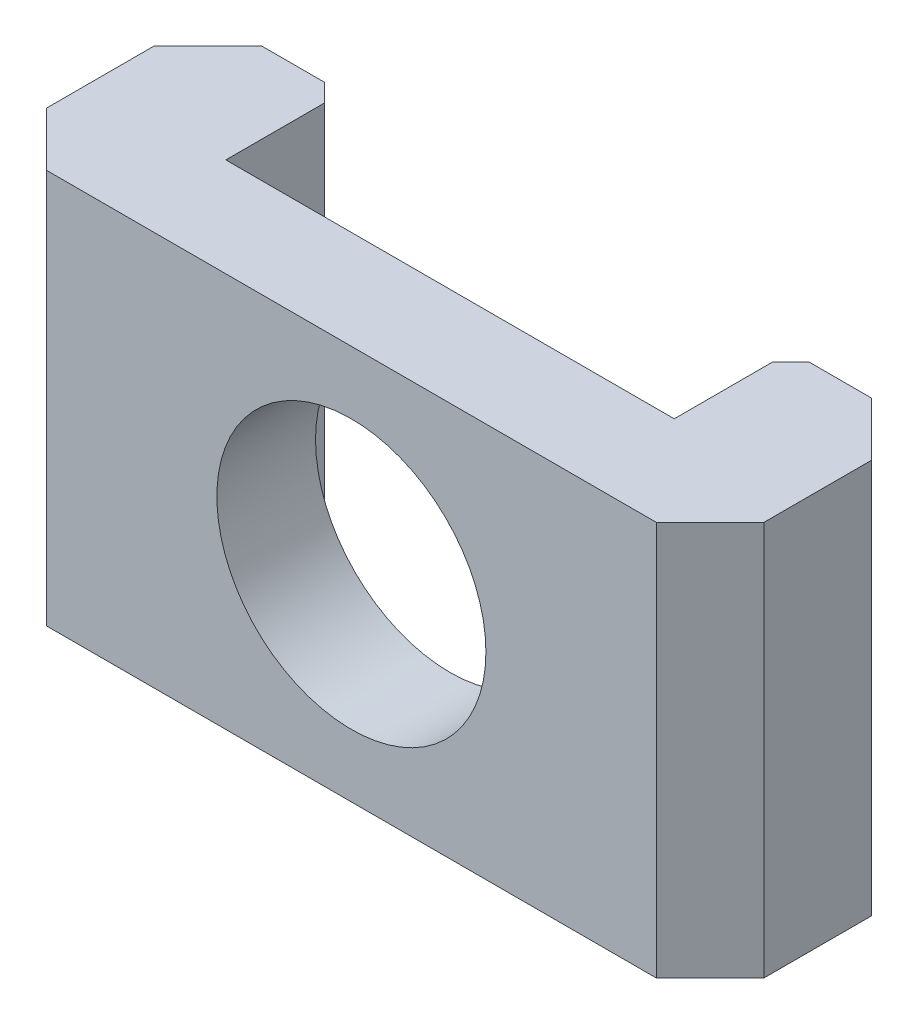
ISO-10303-21;
HEADER;
FILE_DESCRIPTION(('STEP AP214'),'2;1');
FILE_NAME('part.step','',(''),(''),'','','');
FILE_SCHEMA(('AUTOMOTIVE_DESIGN { 1 0 10303 214 1 1 1 1 }'));
ENDSEC;
DATA;
#1=APPLICATION_CONTEXT('core data for automotive mechanical design processes');
#2=APPLICATION_PROTOCOL_DEFINITION('international standard','automotive_design',2000,#1);
#3=PRODUCT_CONTEXT('',#1,'mechanical');
#4=PRODUCT('Part','Part','',(#3));
#5=PRODUCT_RELATED_PRODUCT_CATEGORY('part','',(#4));
#6=PRODUCT_DEFINITION_FORMATION('','',#4);
#7=PRODUCT_DEFINITION_CONTEXT('part definition',#1,'design');
#8=PRODUCT_DEFINITION('design','',#6,#7);
#9=PRODUCT_DEFINITION_SHAPE('','',#8);
#10=(LENGTH_UNIT() NAMED_UNIT(*) SI_UNIT(.MILLI.,.METRE.));
#11=(NAMED_UNIT(*) PLANE_ANGLE_UNIT() SI_UNIT($,.RADIAN.));
#12=(NAMED_UNIT(*) SI_UNIT($,.STERADIAN.) SOLID_ANGLE_UNIT());
#13=UNCERTAINTY_MEASURE_WITH_UNIT(LENGTH_MEASURE(1.E-05),#10,'distance_accuracy_value','');
#14=(GEOMETRIC_REPRESENTATION_CONTEXT(3) GLOBAL_UNCERTAINTY_ASSIGNED_CONTEXT((#13)) GLOBAL_UNIT_ASSIGNED_CONTEXT((#10,
#11,#12)) REPRESENTATION_CONTEXT('',''));
#15=CARTESIAN_POINT('',(0.,0.,0.));
#16=DIRECTION('',(0.,0.,1.));
#17=DIRECTION('',(1.,0.,0.));
#18=AXIS2_PLACEMENT_3D('',#15,#16,#17);
#19=CARTESIAN_POINT('',(-20.,-11.,-6.));
#20=DIRECTION('',(0.,0.,1.));
#21=DIRECTION('',(1.,0.,0.));
#22=AXIS2_PLACEMENT_3D('',#19,#20,#21);
#23=PLANE('',#22);
#24=DIRECTION('',(-1.,0.,0.));
#25=VECTOR('',#24,1.);
#26=CARTESIAN_POINT('',(-20.,11.,-6.));
#27=LINE('',#26,#25);
#28=CARTESIAN_POINT('',(17.,11.,-6.));
#29=VERTEX_POINT('',#28);
#30=CARTESIAN_POINT('',(13.5,11.,-6.));
#31=VERTEX_POINT('',#30);
#32=EDGE_CURVE('E209',#29,#31,#27,.T.);
#33=ORIENTED_EDGE('',*,*,#32,.F.);
#34=DIRECTION('',(0.,-1.,0.));
#35=VECTOR('',#34,1.);
#36=CARTESIAN_POINT('',(17.,-11.,-6.));
#37=LINE('',#36,#35);
#38=CARTESIAN_POINT('',(17.,-11.,-6.));
#39=VERTEX_POINT('',#38);
#40=EDGE_CURVE('E284',#29,#39,#37,.T.);
#41=ORIENTED_EDGE('',*,*,#40,.T.);
#42=DIRECTION('',(1.,0.,0.));
#43=VECTOR('',#42,1.);
#44=CARTESIAN_POINT('',(-20.,-11.,-6.));
#45=LINE('',#44,#43);
#46=CARTESIAN_POINT('',(13.5,-11.,-6.));
#47=VERTEX_POINT('',#46);
#48=EDGE_CURVE('E204',#47,#39,#45,.T.);
#49=ORIENTED_EDGE('',*,*,#48,.F.);
#50=DIRECTION('',(0.,1.,0.));
#51=VECTOR('',#50,1.);
#52=CARTESIAN_POINT('',(13.5,-11.,-6.));
#53=LINE('',#52,#51);
#54=EDGE_CURVE('E268',#47,#31,#53,.T.);
#55=ORIENTED_EDGE('',*,*,#54,.T.);
#56=EDGE_LOOP('',(#33,#41,#49,#55));
#57=FACE_BOUND('',#56,.T.);
#58=ADVANCED_FACE('F38',(#57),#23,.F.);
#59=CARTESIAN_POINT('',(0.,0.,-27.2132034355964));
#60=DIRECTION('',(0.,0.,1.));
#61=DIRECTION('',(1.,0.,0.));
#62=AXIS2_PLACEMENT_3D('',#59,#60,#61);
#63=CYLINDRICAL_SURFACE('',#62,7.5);
#64=CARTESIAN_POINT('',(0.,0.,6.));
#65=DIRECTION('',(0.,0.,1.));
#66=DIRECTION('',(1.,0.,0.));
#67=AXIS2_PLACEMENT_3D('',#64,#65,#66);
#68=CIRCLE('',#67,7.5);
#69=CARTESIAN_POINT('',(7.5,0.,6.));
#70=VERTEX_POINT('',#69);
#71=EDGE_CURVE('E195',#70,#70,#68,.T.);
#72=ORIENTED_EDGE('',*,*,#71,.T.);
#73=EDGE_LOOP('',(#72));
#74=FACE_BOUND('',#73,.T.);
#75=CARTESIAN_POINT('',(0.,0.,0.5));
#76=DIRECTION('',(0.,0.,-1.));
#77=DIRECTION('',(-1.,0.,0.));
#78=AXIS2_PLACEMENT_3D('',#75,#76,#77);
#79=CIRCLE('',#78,7.5);
#80=CARTESIAN_POINT('',(-7.5,0.,0.5));
#81=VERTEX_POINT('',#80);
#82=EDGE_CURVE('E184',#81,#81,#79,.F.);
#83=ORIENTED_EDGE('',*,*,#82,.F.);
#84=EDGE_LOOP('',(#83));
#85=FACE_BOUND('',#84,.T.);
#86=ADVANCED_FACE('F351',(#74,#85),#63,.F.);
#87=CARTESIAN_POINT('',(-20.,11.,6.));
#88=DIRECTION('',(1.,0.,0.));
#89=DIRECTION('',(0.,0.,-1.));
#90=AXIS2_PLACEMENT_3D('',#87,#88,#89);
#91=PLANE('',#90);
#92=DIRECTION('',(0.,0.,-1.));
#93=VECTOR('',#92,1.);
#94=CARTESIAN_POINT('',(-20.,-11.,6.));
#95=LINE('',#94,#93);
#96=CARTESIAN_POINT('',(-20.,-11.,2.99999999999998));
#97=VERTEX_POINT('',#96);
#98=CARTESIAN_POINT('',(-20.,-11.,-3.00000000000001));
#99=VERTEX_POINT('',#98);
#100=EDGE_CURVE('E225',#97,#99,#95,.T.);
#101=ORIENTED_EDGE('',*,*,#100,.F.);
#102=DIRECTION('',(0.,1.,0.));
#103=VECTOR('',#102,1.);
#104=CARTESIAN_POINT('',(-20.,11.,2.99999999999998));
#105=LINE('',#104,#103);
#106=CARTESIAN_POINT('',(-20.,11.,2.99999999999998));
#107=VERTEX_POINT('',#106);
#108=EDGE_CURVE('E46',#97,#107,#105,.T.);
#109=ORIENTED_EDGE('',*,*,#108,.T.);
#110=DIRECTION('',(0.,0.,-1.));
#111=VECTOR('',#110,1.);
#112=CARTESIAN_POINT('',(-20.,11.,6.));
#113=LINE('',#112,#111);
#114=CARTESIAN_POINT('',(-20.,11.,-3.00000000000001));
#115=VERTEX_POINT('',#114);
#116=EDGE_CURVE('E212',#107,#115,#113,.T.);
#117=ORIENTED_EDGE('',*,*,#116,.T.);
#118=DIRECTION('',(0.,-1.,0.));
#119=VECTOR('',#118,1.);
#120=CARTESIAN_POINT('',(-20.,11.,-3.));
#121=LINE('',#120,#119);
#122=EDGE_CURVE('E298',#115,#99,#121,.T.);
#123=ORIENTED_EDGE('',*,*,#122,.T.);
#124=EDGE_LOOP('',(#101,#109,#117,#123));
#125=FACE_BOUND('',#124,.T.);
#126=ADVANCED_FACE('F302',(#125),#91,.F.);
#127=CARTESIAN_POINT('',(-20.,-11.,6.));
#128=DIRECTION('',(0.,1.,0.));
#129=DIRECTION('',(0.,0.,1.));
#130=AXIS2_PLACEMENT_3D('',#127,#128,#129);
#131=PLANE('',#130);
#132=CARTESIAN_POINT('',(16.5,-11.,-3.5));
#133=DIRECTION('',(0.,1.,0.));
#134=DIRECTION('',(0.,0.,1.));
#135=AXIS2_PLACEMENT_3D('',#132,#133,#134);
#136=CIRCLE('',#135,1.75000000000001);
#137=CARTESIAN_POINT('',(16.5,-11.,-1.74999999999999));
#138=VERTEX_POINT('',#137);
#139=EDGE_CURVE('E245',#138,#138,#136,.T.);
#140=ORIENTED_EDGE('',*,*,#139,.T.);
#141=EDGE_LOOP('',(#140));
#142=FACE_BOUND('',#141,.T.);
#143=CARTESIAN_POINT('',(-16.5,-11.,-3.5));
#144=DIRECTION('',(0.,1.,0.));
#145=DIRECTION('',(0.,0.,1.));
#146=AXIS2_PLACEMENT_3D('',#143,#144,#145);
#147=CIRCLE('',#146,1.75000000000001);
#148=CARTESIAN_POINT('',(-16.5,-11.,-1.74999999999999));
#149=VERTEX_POINT('',#148);
#150=EDGE_CURVE('E242',#149,#149,#147,.T.);
#151=ORIENTED_EDGE('',*,*,#150,.T.);
#152=EDGE_LOOP('',(#151));
#153=FACE_BOUND('',#152,.T.);
#154=CARTESIAN_POINT('',(16.5,-11.,3.5));
#155=DIRECTION('',(0.,1.,0.));
#156=DIRECTION('',(0.,0.,1.));
#157=AXIS2_PLACEMENT_3D('',#154,#155,#156);
#158=CIRCLE('',#157,1.74999999999999);
#159=CARTESIAN_POINT('',(16.5,-11.,5.24999999999999));
#160=VERTEX_POINT('',#159);
#161=EDGE_CURVE('E233',#160,#160,#158,.T.);
#162=ORIENTED_EDGE('',*,*,#161,.T.);
#163=EDGE_LOOP('',(#162));
#164=FACE_BOUND('',#163,.T.);
#165=CARTESIAN_POINT('',(-16.5,-11.,3.5));
#166=DIRECTION('',(0.,1.,0.));
#167=DIRECTION('',(0.,0.,1.));
#168=AXIS2_PLACEMENT_3D('',#165,#166,#167);
#169=CIRCLE('',#168,1.74999999999999);
#170=CARTESIAN_POINT('',(-16.5,-11.,5.24999999999999));
#171=VERTEX_POINT('',#170);
#172=EDGE_CURVE('E230',#171,#171,#169,.T.);
#173=ORIENTED_EDGE('',*,*,#172,.T.);
#174=EDGE_LOOP('',(#173));
#175=FACE_BOUND('',#174,.T.);
#176=ORIENTED_EDGE('',*,*,#48,.T.);
#177=DIRECTION('',(-0.707106781186549,0.,-0.707106781186546));
#178=VECTOR('',#177,1.);
#179=CARTESIAN_POINT('',(20.,-11.,-3.));
#180=LINE('',#179,#178);
#181=CARTESIAN_POINT('',(20.,-11.,-3.00000000000001));
#182=VERTEX_POINT('',#181);
#183=EDGE_CURVE('E290',#39,#182,#180,.F.);
#184=ORIENTED_EDGE('',*,*,#183,.T.);
#185=DIRECTION('',(0.,0.,-1.));
#186=VECTOR('',#185,1.);
#187=CARTESIAN_POINT('',(20.,-11.,6.));
#188=LINE('',#187,#186);
#189=CARTESIAN_POINT('',(20.,-11.,2.99999999999998));
#190=VERTEX_POINT('',#189);
#191=EDGE_CURVE('E222',#190,#182,#188,.T.);
#192=ORIENTED_EDGE('',*,*,#191,.F.);
#193=DIRECTION('',(-0.707106781186547,0.,0.707106781186548));
#194=VECTOR('',#193,1.);
#195=CARTESIAN_POINT('',(17.,-11.,6.));
#196=LINE('',#195,#194);
#197=CARTESIAN_POINT('',(17.,-11.,6.));
#198=VERTEX_POINT('',#197);
#199=EDGE_CURVE('E288',#190,#198,#196,.T.);
#200=ORIENTED_EDGE('',*,*,#199,.T.);
#201=DIRECTION('',(1.,0.,0.));
#202=VECTOR('',#201,1.);
#203=CARTESIAN_POINT('',(-20.,-11.,6.));
#204=LINE('',#203,#202);
#205=CARTESIAN_POINT('',(-17.,-11.,6.));
#206=VERTEX_POINT('',#205);
#207=EDGE_CURVE('E205',#206,#198,#204,.T.);
#208=ORIENTED_EDGE('',*,*,#207,.F.);
#209=DIRECTION('',(-0.707106781186547,0.,-0.707106781186548));
#210=VECTOR('',#209,1.);
#211=CARTESIAN_POINT('',(-17.,-11.,6.));
#212=LINE('',#211,#210);
#213=EDGE_CURVE('E61',#206,#97,#212,.T.);
#214=ORIENTED_EDGE('',*,*,#213,.T.);
#215=ORIENTED_EDGE('',*,*,#100,.T.);
#216=DIRECTION('',(-0.707106781186549,0.,0.707106781186546));
#217=VECTOR('',#216,1.);
#218=CARTESIAN_POINT('',(-20.,-11.,-3.));
#219=LINE('',#218,#217);
#220=CARTESIAN_POINT('',(-17.,-11.,-6.));
#221=VERTEX_POINT('',#220);
#222=EDGE_CURVE('E53',#99,#221,#219,.F.);
#223=ORIENTED_EDGE('',*,*,#222,.T.);
#224=CARTESIAN_POINT('',(-13.5,-11.,-6.));
#225=VERTEX_POINT('',#224);
#226=EDGE_CURVE('E213',#221,#225,#45,.T.);
#227=ORIENTED_EDGE('',*,*,#226,.T.);
#228=DIRECTION('',(-0.707106781186548,0.,-0.707106781186548));
#229=VECTOR('',#228,1.);
#230=CARTESIAN_POINT('',(-12.5,-11.,-5.00000000000001));
#231=LINE('',#230,#229);
#232=CARTESIAN_POINT('',(-12.5,-11.,-5.));
#233=VERTEX_POINT('',#232);
#234=EDGE_CURVE('E265',#225,#233,#231,.F.);
#235=ORIENTED_EDGE('',*,*,#234,.T.);
#236=DIRECTION('',(0.,0.,-1.));
#237=VECTOR('',#236,1.);
#238=CARTESIAN_POINT('',(-12.5,-11.,0.5));
#239=LINE('',#238,#237);
#240=CARTESIAN_POINT('',(-12.5,-11.,0.5));
#241=VERTEX_POINT('',#240);
#242=EDGE_CURVE('E161',#241,#233,#239,.T.);
#243=ORIENTED_EDGE('',*,*,#242,.F.);
#244=DIRECTION('',(-1.,0.,0.));
#245=VECTOR('',#244,1.);
#246=CARTESIAN_POINT('',(12.5,-11.,0.5));
#247=LINE('',#246,#245);
#248=CARTESIAN_POINT('',(12.5,-11.,0.5));
#249=VERTEX_POINT('',#248);
#250=EDGE_CURVE('E169',#249,#241,#247,.T.);
#251=ORIENTED_EDGE('',*,*,#250,.F.);
#252=DIRECTION('',(0.,0.,-1.));
#253=VECTOR('',#252,1.);
#254=CARTESIAN_POINT('',(12.5,-11.,0.5));
#255=LINE('',#254,#253);
#256=CARTESIAN_POINT('',(12.5,-11.,-5.));
#257=VERTEX_POINT('',#256);
#258=EDGE_CURVE('E152',#249,#257,#255,.T.);
#259=ORIENTED_EDGE('',*,*,#258,.T.);
#260=DIRECTION('',(-0.707106781186549,0.,0.707106781186546));
#261=VECTOR('',#260,1.);
#262=CARTESIAN_POINT('',(12.5,-11.,-5.00000000000001));
#263=LINE('',#262,#261);
#264=EDGE_CURVE('E263',#257,#47,#263,.F.);
#265=ORIENTED_EDGE('',*,*,#264,.T.);
#266=EDGE_LOOP('',(#176,#184,#192,#200,#208,#214,#215,#223,#227,#235,#243,#251,#259,#265));
#267=FACE_BOUND('',#266,.T.);
#268=ADVANCED_FACE('F175',(#142,#153,#164,#175,#267),#131,.F.);
#269=CARTESIAN_POINT('',(20.,11.,6.));
#270=DIRECTION('',(-1.,0.,0.));
#271=DIRECTION('',(0.,0.,1.));
#272=AXIS2_PLACEMENT_3D('',#269,#270,#271);
#273=PLANE('',#272);
#274=ORIENTED_EDGE('',*,*,#191,.T.);
#275=DIRECTION('',(0.,1.,0.));
#276=VECTOR('',#275,1.);
#277=CARTESIAN_POINT('',(20.,11.,-3.));
#278=LINE('',#277,#276);
#279=CARTESIAN_POINT('',(20.,11.,-3.00000000000001));
#280=VERTEX_POINT('',#279);
#281=EDGE_CURVE('E273',#182,#280,#278,.T.);
#282=ORIENTED_EDGE('',*,*,#281,.T.);
#283=DIRECTION('',(0.,0.,-1.));
#284=VECTOR('',#283,1.);
#285=CARTESIAN_POINT('',(20.,11.,6.));
#286=LINE('',#285,#284);
#287=CARTESIAN_POINT('',(20.,11.,2.99999999999998));
#288=VERTEX_POINT('',#287);
#289=EDGE_CURVE('E219',#288,#280,#286,.T.);
#290=ORIENTED_EDGE('',*,*,#289,.F.);
#291=DIRECTION('',(0.,-1.,0.));
#292=VECTOR('',#291,1.);
#293=CARTESIAN_POINT('',(20.,-11.,2.99999999999998));
#294=LINE('',#293,#292);
#295=EDGE_CURVE('E271',#288,#190,#294,.T.);
#296=ORIENTED_EDGE('',*,*,#295,.T.);
#297=EDGE_LOOP('',(#274,#282,#290,#296));
#298=FACE_BOUND('',#297,.T.);
#299=ADVANCED_FACE('F322',(#298),#273,.F.);
#300=CARTESIAN_POINT('',(-20.,11.,6.));
#301=DIRECTION('',(0.,-1.,0.));
#302=DIRECTION('',(0.,0.,-1.));
#303=AXIS2_PLACEMENT_3D('',#300,#301,#302);
#304=PLANE('',#303);
#305=ORIENTED_EDGE('',*,*,#289,.T.);
#306=DIRECTION('',(0.707106781186549,0.,0.707106781186546));
#307=VECTOR('',#306,1.);
#308=CARTESIAN_POINT('',(20.,11.,-3.));
#309=LINE('',#308,#307);
#310=EDGE_CURVE('E282',#280,#29,#309,.F.);
#311=ORIENTED_EDGE('',*,*,#310,.T.);
#312=ORIENTED_EDGE('',*,*,#32,.T.);
#313=DIRECTION('',(0.707106781186549,0.,-0.707106781186546));
#314=VECTOR('',#313,1.);
#315=CARTESIAN_POINT('',(12.5,11.,-5.00000000000001));
#316=LINE('',#315,#314);
#317=CARTESIAN_POINT('',(12.5,11.,-5.));
#318=VERTEX_POINT('',#317);
#319=EDGE_CURVE('E256',#31,#318,#316,.F.);
#320=ORIENTED_EDGE('',*,*,#319,.T.);
#321=DIRECTION('',(0.,0.,-1.));
#322=VECTOR('',#321,1.);
#323=CARTESIAN_POINT('',(12.5,11.,0.5));
#324=LINE('',#323,#322);
#325=CARTESIAN_POINT('',(12.5,11.,0.5));
#326=VERTEX_POINT('',#325);
#327=EDGE_CURVE('E182',#326,#318,#324,.T.);
#328=ORIENTED_EDGE('',*,*,#327,.F.);
#329=DIRECTION('',(1.,0.,0.));
#330=VECTOR('',#329,1.);
#331=CARTESIAN_POINT('',(12.5,11.,0.5));
#332=LINE('',#331,#330);
#333=CARTESIAN_POINT('',(-12.5,11.,0.5));
#334=VERTEX_POINT('',#333);
#335=EDGE_CURVE('E162',#334,#326,#332,.T.);
#336=ORIENTED_EDGE('',*,*,#335,.F.);
#337=DIRECTION('',(0.,0.,-1.));
#338=VECTOR('',#337,1.);
#339=CARTESIAN_POINT('',(-12.5,11.,0.5));
#340=LINE('',#339,#338);
#341=CARTESIAN_POINT('',(-12.5,11.,-5.));
#342=VERTEX_POINT('',#341);
#343=EDGE_CURVE('E185',#334,#342,#340,.T.);
#344=ORIENTED_EDGE('',*,*,#343,.T.);
#345=DIRECTION('',(0.707106781186548,0.,0.707106781186548));
#346=VECTOR('',#345,1.);
#347=CARTESIAN_POINT('',(-12.5,11.,-5.00000000000001));
#348=LINE('',#347,#346);
#349=CARTESIAN_POINT('',(-13.5,11.,-6.));
#350=VERTEX_POINT('',#349);
#351=EDGE_CURVE('E258',#342,#350,#348,.F.);
#352=ORIENTED_EDGE('',*,*,#351,.T.);
#353=CARTESIAN_POINT('',(-17.,11.,-6.));
#354=VERTEX_POINT('',#353);
#355=EDGE_CURVE('E215',#350,#354,#27,.T.);
#356=ORIENTED_EDGE('',*,*,#355,.T.);
#357=DIRECTION('',(0.707106781186549,0.,-0.707106781186546));
#358=VECTOR('',#357,1.);
#359=CARTESIAN_POINT('',(-20.,11.,-3.));
#360=LINE('',#359,#358);
#361=EDGE_CURVE('E276',#354,#115,#360,.F.);
#362=ORIENTED_EDGE('',*,*,#361,.T.);
#363=ORIENTED_EDGE('',*,*,#116,.F.);
#364=DIRECTION('',(0.707106781186547,0.,0.707106781186548));
#365=VECTOR('',#364,1.);
#366=CARTESIAN_POINT('',(-17.,11.,6.));
#367=LINE('',#366,#365);
#368=CARTESIAN_POINT('',(-17.,11.,6.));
#369=VERTEX_POINT('',#368);
#370=EDGE_CURVE('E278',#107,#369,#367,.T.);
#371=ORIENTED_EDGE('',*,*,#370,.T.);
#372=DIRECTION('',(-1.,0.,0.));
#373=VECTOR('',#372,1.);
#374=CARTESIAN_POINT('',(-20.,11.,6.));
#375=LINE('',#374,#373);
#376=CARTESIAN_POINT('',(17.,11.,6.));
#377=VERTEX_POINT('',#376);
#378=EDGE_CURVE('E208',#377,#369,#375,.T.);
#379=ORIENTED_EDGE('',*,*,#378,.F.);
#380=DIRECTION('',(0.707106781186547,0.,-0.707106781186548));
#381=VECTOR('',#380,1.);
#382=CARTESIAN_POINT('',(17.,11.,6.));
#383=LINE('',#382,#381);
#384=EDGE_CURVE('E280',#377,#288,#383,.T.);
#385=ORIENTED_EDGE('',*,*,#384,.T.);
#386=EDGE_LOOP('',(#305,#311,#312,#320,#328,#336,#344,#352,#356,#362,#363,#371,#379,#385));
#387=FACE_BOUND('',#386,.T.);
#388=ADVANCED_FACE('F306',(#387),#304,.F.);
#389=CARTESIAN_POINT('',(-20.,-11.,6.));
#390=DIRECTION('',(0.,0.,1.));
#391=DIRECTION('',(1.,0.,0.));
#392=AXIS2_PLACEMENT_3D('',#389,#390,#391);
#393=PLANE('',#392);
#394=ORIENTED_EDGE('',*,*,#71,.F.);
#395=EDGE_LOOP('',(#394));
#396=FACE_BOUND('',#395,.T.);
#397=ORIENTED_EDGE('',*,*,#207,.T.);
#398=DIRECTION('',(0.,1.,0.));
#399=VECTOR('',#398,1.);
#400=CARTESIAN_POINT('',(17.,11.,6.));
#401=LINE('',#400,#399);
#402=EDGE_CURVE('E295',#198,#377,#401,.T.);
#403=ORIENTED_EDGE('',*,*,#402,.T.);
#404=ORIENTED_EDGE('',*,*,#378,.T.);
#405=DIRECTION('',(0.,-1.,0.));
#406=VECTOR('',#405,1.);
#407=CARTESIAN_POINT('',(-17.,-11.,6.));
#408=LINE('',#407,#406);
#409=EDGE_CURVE('E292',#369,#206,#408,.T.);
#410=ORIENTED_EDGE('',*,*,#409,.T.);
#411=EDGE_LOOP('',(#397,#403,#404,#410));
#412=FACE_BOUND('',#411,.T.);
#413=ADVANCED_FACE('F313',(#396,#412),#393,.T.);
#414=ORIENTED_EDGE('',*,*,#226,.F.);
#415=DIRECTION('',(0.,1.,0.));
#416=VECTOR('',#415,1.);
#417=CARTESIAN_POINT('',(-17.,-11.,-6.));
#418=LINE('',#417,#416);
#419=EDGE_CURVE('E11',#221,#354,#418,.T.);
#420=ORIENTED_EDGE('',*,*,#419,.T.);
#421=ORIENTED_EDGE('',*,*,#355,.F.);
#422=DIRECTION('',(0.,-1.,0.));
#423=VECTOR('',#422,1.);
#424=CARTESIAN_POINT('',(-13.5,-11.,-6.));
#425=LINE('',#424,#423);
#426=EDGE_CURVE('E260',#350,#225,#425,.T.);
#427=ORIENTED_EDGE('',*,*,#426,.T.);
#428=EDGE_LOOP('',(#414,#420,#421,#427));
#429=FACE_BOUND('',#428,.T.);
#430=ADVANCED_FACE('F345',(#429),#23,.F.);
#431=CARTESIAN_POINT('',(16.5,-1.5,3.5));
#432=DIRECTION('',(0.,-1.,0.));
#433=DIRECTION('',(0.,0.,-1.));
#434=AXIS2_PLACEMENT_3D('',#431,#432,#433);
#435=CONICAL_SURFACE('',#434,1.25,1.02974425867665);
#436=CARTESIAN_POINT('',(16.5,-0.748924226215548,3.5));
#437=VERTEX_POINT('',#436);
#438=VERTEX_LOOP('',#437);
#439=FACE_BOUND('',#438,.T.);
#440=CARTESIAN_POINT('',(16.5,-1.5,3.5));
#441=DIRECTION('',(0.,-1.,0.));
#442=DIRECTION('',(0.,0.,-1.));
#443=AXIS2_PLACEMENT_3D('',#440,#441,#442);
#444=CIRCLE('',#443,1.25);
#445=CARTESIAN_POINT('',(16.5,-1.5,2.25));
#446=VERTEX_POINT('',#445);
#447=EDGE_CURVE('E201',#446,#446,#444,.T.);
#448=ORIENTED_EDGE('',*,*,#447,.T.);
#449=EDGE_LOOP('',(#448));
#450=FACE_BOUND('',#449,.T.);
#451=ADVANCED_FACE('F361',(#439,#450),#435,.F.);
#452=CARTESIAN_POINT('',(16.5,-11.,3.5));
#453=DIRECTION('',(0.,-1.,0.));
#454=DIRECTION('',(0.,0.,-1.));
#455=AXIS2_PLACEMENT_3D('',#452,#453,#454);
#456=CYLINDRICAL_SURFACE('',#455,1.25);
#457=CARTESIAN_POINT('',(16.5,-10.5,3.5));
#458=DIRECTION('',(0.,1.,0.));
#459=DIRECTION('',(0.,0.,1.));
#460=AXIS2_PLACEMENT_3D('',#457,#458,#459);
#461=CIRCLE('',#460,1.25);
#462=CARTESIAN_POINT('',(16.5,-10.5,4.75));
#463=VERTEX_POINT('',#462);
#464=EDGE_CURVE('E227',#463,#463,#461,.F.);
#465=ORIENTED_EDGE('',*,*,#464,.T.);
#466=EDGE_LOOP('',(#465));
#467=FACE_BOUND('',#466,.T.);
#468=ORIENTED_EDGE('',*,*,#447,.F.);
#469=EDGE_LOOP('',(#468));
#470=FACE_BOUND('',#469,.T.);
#471=ADVANCED_FACE('F366',(#467,#470),#456,.F.);
#472=CARTESIAN_POINT('',(-16.5,-1.5,3.5));
#473=DIRECTION('',(0.,-1.,0.));
#474=DIRECTION('',(0.,0.,-1.));
#475=AXIS2_PLACEMENT_3D('',#472,#473,#474);
#476=CONICAL_SURFACE('',#475,1.25,1.02974425867665);
#477=CARTESIAN_POINT('',(-16.5,-0.748924226215548,3.5));
#478=VERTEX_POINT('',#477);
#479=VERTEX_LOOP('',#478);
#480=FACE_BOUND('',#479,.T.);
#481=CARTESIAN_POINT('',(-16.5,-1.5,3.5));
#482=DIRECTION('',(0.,-1.,0.));
#483=DIRECTION('',(0.,0.,-1.));
#484=AXIS2_PLACEMENT_3D('',#481,#482,#483);
#485=CIRCLE('',#484,1.25);
#486=CARTESIAN_POINT('',(-16.5,-1.5,2.25));
#487=VERTEX_POINT('',#486);
#488=EDGE_CURVE('E198',#487,#487,#485,.T.);
#489=ORIENTED_EDGE('',*,*,#488,.T.);
#490=EDGE_LOOP('',(#489));
#491=FACE_BOUND('',#490,.T.);
#492=ADVANCED_FACE('F377',(#480,#491),#476,.F.);
#493=CARTESIAN_POINT('',(-16.5,-11.,3.5));
#494=DIRECTION('',(0.,-1.,0.));
#495=DIRECTION('',(0.,0.,-1.));
#496=AXIS2_PLACEMENT_3D('',#493,#494,#495);
#497=CYLINDRICAL_SURFACE('',#496,1.25);
#498=CARTESIAN_POINT('',(-16.5,-10.5,3.5));
#499=DIRECTION('',(0.,1.,0.));
#500=DIRECTION('',(0.,0.,1.));
#501=AXIS2_PLACEMENT_3D('',#498,#499,#500);
#502=CIRCLE('',#501,1.25);
#503=CARTESIAN_POINT('',(-16.5,-10.5,4.75));
#504=VERTEX_POINT('',#503);
#505=EDGE_CURVE('E236',#504,#504,#502,.F.);
#506=ORIENTED_EDGE('',*,*,#505,.T.);
#507=EDGE_LOOP('',(#506));
#508=FACE_BOUND('',#507,.T.);
#509=ORIENTED_EDGE('',*,*,#488,.F.);
#510=EDGE_LOOP('',(#509));
#511=FACE_BOUND('',#510,.T.);
#512=ADVANCED_FACE('F381',(#508,#511),#497,.F.);
#513=CARTESIAN_POINT('',(16.5,-10.5,3.5));
#514=DIRECTION('',(0.,-1.,0.));
#515=DIRECTION('',(0.,0.,-1.));
#516=AXIS2_PLACEMENT_3D('',#513,#514,#515);
#517=CONICAL_SURFACE('',#516,1.25,0.785398163397451);
#518=ORIENTED_EDGE('',*,*,#161,.F.);
#519=EDGE_LOOP('',(#518));
#520=FACE_BOUND('',#519,.T.);
#521=ORIENTED_EDGE('',*,*,#464,.F.);
#522=EDGE_LOOP('',(#521));
#523=FACE_BOUND('',#522,.T.);
#524=ADVANCED_FACE('F384',(#520,#523),#517,.F.);
#525=CARTESIAN_POINT('',(-16.5,-10.5,3.5));
#526=DIRECTION('',(0.,-1.,0.));
#527=DIRECTION('',(0.,0.,-1.));
#528=AXIS2_PLACEMENT_3D('',#525,#526,#527);
#529=CONICAL_SURFACE('',#528,1.25,0.78539816339745);
#530=ORIENTED_EDGE('',*,*,#172,.F.);
#531=EDGE_LOOP('',(#530));
#532=FACE_BOUND('',#531,.T.);
#533=ORIENTED_EDGE('',*,*,#505,.F.);
#534=EDGE_LOOP('',(#533));
#535=FACE_BOUND('',#534,.T.);
#536=ADVANCED_FACE('F391',(#532,#535),#529,.F.);
#537=CARTESIAN_POINT('',(16.5,-1.5,-3.5));
#538=DIRECTION('',(0.,-1.,0.));
#539=DIRECTION('',(0.,0.,-1.));
#540=AXIS2_PLACEMENT_3D('',#537,#538,#539);
#541=CONICAL_SURFACE('',#540,1.25,1.02974425867665);
#542=CARTESIAN_POINT('',(16.5,-0.748924226215548,-3.5));
#543=VERTEX_POINT('',#542);
#544=VERTEX_LOOP('',#543);
#545=FACE_BOUND('',#544,.T.);
#546=CARTESIAN_POINT('',(16.5,-1.5,-3.5));
#547=DIRECTION('',(0.,-1.,0.));
#548=DIRECTION('',(0.,0.,-1.));
#549=AXIS2_PLACEMENT_3D('',#546,#547,#548);
#550=CIRCLE('',#549,1.25);
#551=CARTESIAN_POINT('',(16.5,-1.5,-4.75));
#552=VERTEX_POINT('',#551);
#553=EDGE_CURVE('E192',#552,#552,#550,.T.);
#554=ORIENTED_EDGE('',*,*,#553,.T.);
#555=EDGE_LOOP('',(#554));
#556=FACE_BOUND('',#555,.T.);
#557=ADVANCED_FACE('F387',(#545,#556),#541,.F.);
#558=CARTESIAN_POINT('',(16.5,-11.,-3.5));
#559=DIRECTION('',(0.,-1.,0.));
#560=DIRECTION('',(0.,0.,-1.));
#561=AXIS2_PLACEMENT_3D('',#558,#559,#560);
#562=CYLINDRICAL_SURFACE('',#561,1.25);
#563=CARTESIAN_POINT('',(16.5,-10.5,-3.5));
#564=DIRECTION('',(0.,1.,0.));
#565=DIRECTION('',(0.,0.,1.));
#566=AXIS2_PLACEMENT_3D('',#563,#564,#565);
#567=CIRCLE('',#566,1.25);
#568=CARTESIAN_POINT('',(16.5,-10.5,-2.25));
#569=VERTEX_POINT('',#568);
#570=EDGE_CURVE('E239',#569,#569,#567,.F.);
#571=ORIENTED_EDGE('',*,*,#570,.T.);
#572=EDGE_LOOP('',(#571));
#573=FACE_BOUND('',#572,.T.);
#574=ORIENTED_EDGE('',*,*,#553,.F.);
#575=EDGE_LOOP('',(#574));
#576=FACE_BOUND('',#575,.T.);
#577=ADVANCED_FACE('F390',(#573,#576),#562,.F.);
#578=CARTESIAN_POINT('',(-16.5,-1.5,-3.5));
#579=DIRECTION('',(0.,-1.,0.));
#580=DIRECTION('',(0.,0.,-1.));
#581=AXIS2_PLACEMENT_3D('',#578,#579,#580);
#582=CONICAL_SURFACE('',#581,1.25,1.02974425867665);
#583=CARTESIAN_POINT('',(-16.5,-0.748924226215548,-3.5));
#584=VERTEX_POINT('',#583);
#585=VERTEX_LOOP('',#584);
#586=FACE_BOUND('',#585,.T.);
#587=CARTESIAN_POINT('',(-16.5,-1.5,-3.5));
#588=DIRECTION('',(0.,-1.,0.));
#589=DIRECTION('',(0.,0.,-1.));
#590=AXIS2_PLACEMENT_3D('',#587,#588,#589);
#591=CIRCLE('',#590,1.25);
#592=CARTESIAN_POINT('',(-16.5,-1.5,-4.75));
#593=VERTEX_POINT('',#592);
#594=EDGE_CURVE('E189',#593,#593,#591,.T.);
#595=ORIENTED_EDGE('',*,*,#594,.T.);
#596=EDGE_LOOP('',(#595));
#597=FACE_BOUND('',#596,.T.);
#598=ADVANCED_FACE('F395',(#586,#597),#582,.F.);
#599=CARTESIAN_POINT('',(-16.5,-11.,-3.5));
#600=DIRECTION('',(0.,-1.,0.));
#601=DIRECTION('',(0.,0.,-1.));
#602=AXIS2_PLACEMENT_3D('',#599,#600,#601);
#603=CYLINDRICAL_SURFACE('',#602,1.25);
#604=CARTESIAN_POINT('',(-16.5,-10.5,-3.5));
#605=DIRECTION('',(0.,1.,0.));
#606=DIRECTION('',(0.,0.,1.));
#607=AXIS2_PLACEMENT_3D('',#604,#605,#606);
#608=CIRCLE('',#607,1.25);
#609=CARTESIAN_POINT('',(-16.5,-10.5,-2.25));
#610=VERTEX_POINT('',#609);
#611=EDGE_CURVE('E248',#610,#610,#608,.F.);
#612=ORIENTED_EDGE('',*,*,#611,.T.);
#613=EDGE_LOOP('',(#612));
#614=FACE_BOUND('',#613,.T.);
#615=ORIENTED_EDGE('',*,*,#594,.F.);
#616=EDGE_LOOP('',(#615));
#617=FACE_BOUND('',#616,.T.);
#618=ADVANCED_FACE('F399',(#614,#617),#603,.F.);
#619=CARTESIAN_POINT('',(16.5,-10.5,-3.5));
#620=DIRECTION('',(0.,-1.,0.));
#621=DIRECTION('',(0.,0.,-1.));
#622=AXIS2_PLACEMENT_3D('',#619,#620,#621);
#623=CONICAL_SURFACE('',#622,1.25,0.785398163397452);
#624=ORIENTED_EDGE('',*,*,#139,.F.);
#625=EDGE_LOOP('',(#624));
#626=FACE_BOUND('',#625,.T.);
#627=ORIENTED_EDGE('',*,*,#570,.F.);
#628=EDGE_LOOP('',(#627));
#629=FACE_BOUND('',#628,.T.);
#630=ADVANCED_FACE('F403',(#626,#629),#623,.F.);
#631=CARTESIAN_POINT('',(-16.5,-10.5,-3.5));
#632=DIRECTION('',(0.,-1.,0.));
#633=DIRECTION('',(0.,0.,-1.));
#634=AXIS2_PLACEMENT_3D('',#631,#632,#633);
#635=CONICAL_SURFACE('',#634,1.25,0.785398163397451);
#636=ORIENTED_EDGE('',*,*,#150,.F.);
#637=EDGE_LOOP('',(#636));
#638=FACE_BOUND('',#637,.T.);
#639=ORIENTED_EDGE('',*,*,#611,.F.);
#640=EDGE_LOOP('',(#639));
#641=FACE_BOUND('',#640,.T.);
#642=ADVANCED_FACE('F410',(#638,#641),#635,.F.);
#643=CARTESIAN_POINT('',(12.5,-11.,0.5));
#644=DIRECTION('',(0.,0.,-1.));
#645=DIRECTION('',(-1.,0.,0.));
#646=AXIS2_PLACEMENT_3D('',#643,#644,#645);
#647=PLANE('',#646);
#648=DIRECTION('',(0.,-1.,0.));
#649=VECTOR('',#648,1.);
#650=CARTESIAN_POINT('',(12.5,11.,0.5));
#651=LINE('',#650,#649);
#652=EDGE_CURVE('E156',#326,#249,#651,.T.);
#653=ORIENTED_EDGE('',*,*,#652,.T.);
#654=ORIENTED_EDGE('',*,*,#250,.T.);
#655=DIRECTION('',(0.,1.,0.));
#656=VECTOR('',#655,1.);
#657=CARTESIAN_POINT('',(-12.5,11.,0.5));
#658=LINE('',#657,#656);
#659=EDGE_CURVE('E177',#241,#334,#658,.T.);
#660=ORIENTED_EDGE('',*,*,#659,.T.);
#661=ORIENTED_EDGE('',*,*,#335,.T.);
#662=EDGE_LOOP('',(#653,#654,#660,#661));
#663=FACE_BOUND('',#662,.T.);
#664=ORIENTED_EDGE('',*,*,#82,.T.);
#665=EDGE_LOOP('',(#664));
#666=FACE_BOUND('',#665,.T.);
#667=ADVANCED_FACE('F166',(#663,#666),#647,.T.);
#668=CARTESIAN_POINT('',(12.5,11.,0.5));
#669=DIRECTION('',(1.,0.,0.));
#670=DIRECTION('',(0.,1.,0.));
#671=AXIS2_PLACEMENT_3D('',#668,#669,#670);
#672=PLANE('',#671);
#673=ORIENTED_EDGE('',*,*,#327,.T.);
#674=DIRECTION('',(0.,-1.,0.));
#675=VECTOR('',#674,1.);
#676=CARTESIAN_POINT('',(12.5,11.,-5.00000000000001));
#677=LINE('',#676,#675);
#678=EDGE_CURVE('E159',#318,#257,#677,.T.);
#679=ORIENTED_EDGE('',*,*,#678,.T.);
#680=ORIENTED_EDGE('',*,*,#258,.F.);
#681=ORIENTED_EDGE('',*,*,#652,.F.);
#682=EDGE_LOOP('',(#673,#679,#680,#681));
#683=FACE_BOUND('',#682,.T.);
#684=ADVANCED_FACE('F155',(#683),#672,.F.);
#685=CARTESIAN_POINT('',(-12.5,11.,0.5));
#686=DIRECTION('',(-1.,0.,0.));
#687=DIRECTION('',(0.,-1.,0.));
#688=AXIS2_PLACEMENT_3D('',#685,#686,#687);
#689=PLANE('',#688);
#690=ORIENTED_EDGE('',*,*,#242,.T.);
#691=DIRECTION('',(0.,1.,0.));
#692=VECTOR('',#691,1.);
#693=CARTESIAN_POINT('',(-12.5,11.,-5.00000000000001));
#694=LINE('',#693,#692);
#695=EDGE_CURVE('E251',#233,#342,#694,.T.);
#696=ORIENTED_EDGE('',*,*,#695,.T.);
#697=ORIENTED_EDGE('',*,*,#343,.F.);
#698=ORIENTED_EDGE('',*,*,#659,.F.);
#699=EDGE_LOOP('',(#690,#696,#697,#698));
#700=FACE_BOUND('',#699,.T.);
#701=ADVANCED_FACE('F337',(#700),#689,.F.);
#702=CARTESIAN_POINT('',(-12.5,11.,-5.00000000000001));
#703=DIRECTION('',(-0.707106781186547,0.,0.707106781186547));
#704=DIRECTION('',(0.707106781186548,0.,0.707106781186548));
#705=AXIS2_PLACEMENT_3D('',#702,#703,#704);
#706=PLANE('',#705);
#707=ORIENTED_EDGE('',*,*,#234,.F.);
#708=ORIENTED_EDGE('',*,*,#426,.F.);
#709=ORIENTED_EDGE('',*,*,#351,.F.);
#710=ORIENTED_EDGE('',*,*,#695,.F.);
#711=EDGE_LOOP('',(#707,#708,#709,#710));
#712=FACE_BOUND('',#711,.T.);
#713=ADVANCED_FACE('F341',(#712),#706,.F.);
#714=CARTESIAN_POINT('',(12.5,11.,-5.00000000000001));
#715=DIRECTION('',(0.707106781186546,0.,0.707106781186549));
#716=DIRECTION('',(0.707106781186549,0.,-0.707106781186546));
#717=AXIS2_PLACEMENT_3D('',#714,#715,#716);
#718=PLANE('',#717);
#719=ORIENTED_EDGE('',*,*,#319,.F.);
#720=ORIENTED_EDGE('',*,*,#54,.F.);
#721=ORIENTED_EDGE('',*,*,#264,.F.);
#722=ORIENTED_EDGE('',*,*,#678,.F.);
#723=EDGE_LOOP('',(#719,#720,#721,#722));
#724=FACE_BOUND('',#723,.T.);
#725=ADVANCED_FACE('F334',(#724),#718,.F.);
#726=CARTESIAN_POINT('',(20.,11.,-3.));
#727=DIRECTION('',(-0.707106781186546,0.,0.707106781186549));
#728=DIRECTION('',(0.707106781186549,0.,0.707106781186546));
#729=AXIS2_PLACEMENT_3D('',#726,#727,#728);
#730=PLANE('',#729);
#731=ORIENTED_EDGE('',*,*,#183,.F.);
#732=ORIENTED_EDGE('',*,*,#40,.F.);
#733=ORIENTED_EDGE('',*,*,#310,.F.);
#734=ORIENTED_EDGE('',*,*,#281,.F.);
#735=EDGE_LOOP('',(#731,#732,#733,#734));
#736=FACE_BOUND('',#735,.T.);
#737=ADVANCED_FACE('F326',(#736),#730,.F.);
#738=CARTESIAN_POINT('',(17.,-11.,6.));
#739=DIRECTION('',(0.707106781186548,0.,0.707106781186547));
#740=DIRECTION('',(0.707106781186547,0.,-0.707106781186548));
#741=AXIS2_PLACEMENT_3D('',#738,#739,#740);
#742=PLANE('',#741);
#743=ORIENTED_EDGE('',*,*,#199,.F.);
#744=ORIENTED_EDGE('',*,*,#295,.F.);
#745=ORIENTED_EDGE('',*,*,#384,.F.);
#746=ORIENTED_EDGE('',*,*,#402,.F.);
#747=EDGE_LOOP('',(#743,#744,#745,#746));
#748=FACE_BOUND('',#747,.T.);
#749=ADVANCED_FACE('F319',(#748),#742,.T.);
#750=CARTESIAN_POINT('',(-17.,-11.,6.));
#751=DIRECTION('',(-0.707106781186548,0.,0.707106781186547));
#752=DIRECTION('',(0.707106781186547,0.,0.707106781186548));
#753=AXIS2_PLACEMENT_3D('',#750,#751,#752);
#754=PLANE('',#753);
#755=ORIENTED_EDGE('',*,*,#370,.F.);
#756=ORIENTED_EDGE('',*,*,#108,.F.);
#757=ORIENTED_EDGE('',*,*,#213,.F.);
#758=ORIENTED_EDGE('',*,*,#409,.F.);
#759=EDGE_LOOP('',(#755,#756,#757,#758));
#760=FACE_BOUND('',#759,.T.);
#761=ADVANCED_FACE('F311',(#760),#754,.T.);
#762=CARTESIAN_POINT('',(-20.,11.,-3.));
#763=DIRECTION('',(0.707106781186546,0.,0.707106781186549));
#764=DIRECTION('',(0.707106781186549,0.,-0.707106781186546));
#765=AXIS2_PLACEMENT_3D('',#762,#763,#764);
#766=PLANE('',#765);
#767=ORIENTED_EDGE('',*,*,#361,.F.);
#768=ORIENTED_EDGE('',*,*,#419,.F.);
#769=ORIENTED_EDGE('',*,*,#222,.F.);
#770=ORIENTED_EDGE('',*,*,#122,.F.);
#771=EDGE_LOOP('',(#767,#768,#769,#770));
#772=FACE_BOUND('',#771,.T.);
#773=ADVANCED_FACE('F40',(#772),#766,.F.);
#774=CLOSED_SHELL('',(#58,#86,#126,#268,#299,#388,#413,#430,#451,#471,#492,#512,#524,#536,#557,
#577,#598,#618,#630,#642,#667,#684,#701,#713,#725,#737,#749,#761,#773));
#775=MANIFOLD_SOLID_BREP('B2',#774);
#776=ADVANCED_BREP_SHAPE_REPRESENTATION('',(#18,#775),#14);
#777=SHAPE_DEFINITION_REPRESENTATION(#9,#776);
ENDSEC;
END-ISO-10303-21;
